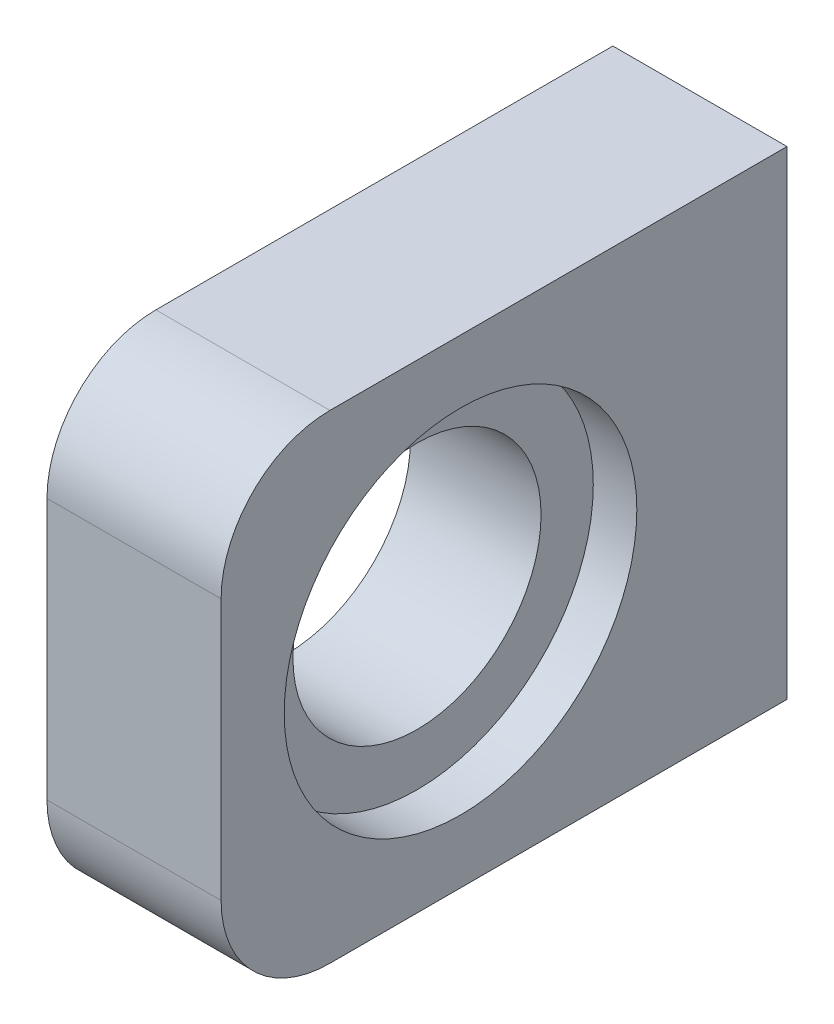
ISO-10303-21;
HEADER;
FILE_DESCRIPTION(('STEP AP214'),'2;1');
FILE_NAME('part.step','',(''),(''),'','','');
FILE_SCHEMA(('AUTOMOTIVE_DESIGN { 1 0 10303 214 1 1 1 1 }'));
ENDSEC;
DATA;
#1=APPLICATION_CONTEXT('core data for automotive mechanical design processes');
#2=APPLICATION_PROTOCOL_DEFINITION('international standard','automotive_design',2000,#1);
#3=PRODUCT_CONTEXT('',#1,'mechanical');
#4=PRODUCT('Part','Part','',(#3));
#5=PRODUCT_RELATED_PRODUCT_CATEGORY('part','',(#4));
#6=PRODUCT_DEFINITION_FORMATION('','',#4);
#7=PRODUCT_DEFINITION_CONTEXT('part definition',#1,'design');
#8=PRODUCT_DEFINITION('design','',#6,#7);
#9=PRODUCT_DEFINITION_SHAPE('','',#8);
#10=(LENGTH_UNIT() NAMED_UNIT(*) SI_UNIT(.MILLI.,.METRE.));
#11=(NAMED_UNIT(*) PLANE_ANGLE_UNIT() SI_UNIT($,.RADIAN.));
#12=(NAMED_UNIT(*) SI_UNIT($,.STERADIAN.) SOLID_ANGLE_UNIT());
#13=UNCERTAINTY_MEASURE_WITH_UNIT(LENGTH_MEASURE(1.E-05),#10,'distance_accuracy_value','');
#14=(GEOMETRIC_REPRESENTATION_CONTEXT(3) GLOBAL_UNCERTAINTY_ASSIGNED_CONTEXT((#13)) GLOBAL_UNIT_ASSIGNED_CONTEXT((#10,
#11,#12)) REPRESENTATION_CONTEXT('',''));
#15=CARTESIAN_POINT('',(0.,0.,0.));
#16=DIRECTION('',(0.,0.,1.));
#17=DIRECTION('',(1.,0.,0.));
#18=AXIS2_PLACEMENT_3D('',#15,#16,#17);
#19=CARTESIAN_POINT('',(0.,22.,-4.));
#20=DIRECTION('',(0.,1.,0.));
#21=DIRECTION('',(0.,0.,1.));
#22=AXIS2_PLACEMENT_3D('',#19,#20,#21);
#23=PLANE('',#22);
#24=DIRECTION('',(0.,0.,1.));
#25=VECTOR('',#24,1.);
#26=CARTESIAN_POINT('',(0.,22.,-4.));
#27=LINE('',#26,#25);
#28=CARTESIAN_POINT('',(0.,22.,-4.));
#29=VERTEX_POINT('',#28);
#30=CARTESIAN_POINT('',(0.,22.,17.));
#31=VERTEX_POINT('',#30);
#32=EDGE_CURVE('E119',#29,#31,#27,.T.);
#33=ORIENTED_EDGE('',*,*,#32,.T.);
#34=DIRECTION('',(1.,0.,0.));
#35=VECTOR('',#34,1.);
#36=CARTESIAN_POINT('',(0.,22.,17.));
#37=LINE('',#36,#35);
#38=CARTESIAN_POINT('',(8.,22.,17.));
#39=VERTEX_POINT('',#38);
#40=EDGE_CURVE('E142',#31,#39,#37,.T.);
#41=ORIENTED_EDGE('',*,*,#40,.T.);
#42=DIRECTION('',(0.,0.,1.));
#43=VECTOR('',#42,1.);
#44=CARTESIAN_POINT('',(8.,22.,-4.));
#45=LINE('',#44,#43);
#46=CARTESIAN_POINT('',(8.,22.,-4.));
#47=VERTEX_POINT('',#46);
#48=EDGE_CURVE('E116',#47,#39,#45,.T.);
#49=ORIENTED_EDGE('',*,*,#48,.F.);
#50=DIRECTION('',(1.,0.,0.));
#51=VECTOR('',#50,1.);
#52=CARTESIAN_POINT('',(0.,22.,-4.));
#53=LINE('',#52,#51);
#54=EDGE_CURVE('E140',#29,#47,#53,.T.);
#55=ORIENTED_EDGE('',*,*,#54,.F.);
#56=EDGE_LOOP('',(#33,#41,#49,#55));
#57=FACE_BOUND('',#56,.T.);
#58=ADVANCED_FACE('F32',(#57),#23,.T.);
#59=CARTESIAN_POINT('',(0.,0.,-4.));
#60=DIRECTION('',(0.,0.,-1.));
#61=DIRECTION('',(0.,1.,0.));
#62=AXIS2_PLACEMENT_3D('',#59,#60,#61);
#63=PLANE('',#62);
#64=CARTESIAN_POINT('',(4.,16.,-4.));
#65=DIRECTION('',(0.,0.,-1.));
#66=DIRECTION('',(0.,1.,0.));
#67=AXIS2_PLACEMENT_3D('',#64,#65,#66);
#68=CIRCLE('',#67,1.64999999999999);
#69=CARTESIAN_POINT('',(4.,17.65,-4.));
#70=VERTEX_POINT('',#69);
#71=EDGE_CURVE('E100',#70,#70,#68,.T.);
#72=ORIENTED_EDGE('',*,*,#71,.F.);
#73=EDGE_LOOP('',(#72));
#74=FACE_BOUND('',#73,.T.);
#75=CARTESIAN_POINT('',(4.,6.,-4.));
#76=DIRECTION('',(0.,0.,-1.));
#77=DIRECTION('',(0.,1.,0.));
#78=AXIS2_PLACEMENT_3D('',#75,#76,#77);
#79=CIRCLE('',#78,1.64999999999999);
#80=CARTESIAN_POINT('',(4.,7.64999999999999,-4.));
#81=VERTEX_POINT('',#80);
#82=EDGE_CURVE('E99',#81,#81,#79,.T.);
#83=ORIENTED_EDGE('',*,*,#82,.F.);
#84=EDGE_LOOP('',(#83));
#85=FACE_BOUND('',#84,.T.);
#86=DIRECTION('',(0.,1.,0.));
#87=VECTOR('',#86,1.);
#88=CARTESIAN_POINT('',(8.,0.,-4.));
#89=LINE('',#88,#87);
#90=CARTESIAN_POINT('',(8.,0.,-4.));
#91=VERTEX_POINT('',#90);
#92=EDGE_CURVE('E123',#91,#47,#89,.T.);
#93=ORIENTED_EDGE('',*,*,#92,.F.);
#94=DIRECTION('',(1.,0.,0.));
#95=VECTOR('',#94,1.);
#96=CARTESIAN_POINT('',(0.,0.,-4.));
#97=LINE('',#96,#95);
#98=CARTESIAN_POINT('',(0.,0.,-4.));
#99=VERTEX_POINT('',#98);
#100=EDGE_CURVE('E130',#99,#91,#97,.T.);
#101=ORIENTED_EDGE('',*,*,#100,.F.);
#102=DIRECTION('',(0.,1.,0.));
#103=VECTOR('',#102,1.);
#104=CARTESIAN_POINT('',(0.,0.,-4.));
#105=LINE('',#104,#103);
#106=EDGE_CURVE('E127',#99,#29,#105,.T.);
#107=ORIENTED_EDGE('',*,*,#106,.T.);
#108=ORIENTED_EDGE('',*,*,#54,.T.);
#109=EDGE_LOOP('',(#93,#101,#107,#108));
#110=FACE_BOUND('',#109,.T.);
#111=ADVANCED_FACE('F177',(#74,#85,#110),#63,.T.);
#112=CARTESIAN_POINT('',(0.,0.,22.));
#113=DIRECTION('',(0.,-1.,0.));
#114=DIRECTION('',(0.,0.,-1.));
#115=AXIS2_PLACEMENT_3D('',#112,#113,#114);
#116=PLANE('',#115);
#117=DIRECTION('',(0.,0.,-1.));
#118=VECTOR('',#117,1.);
#119=CARTESIAN_POINT('',(8.,0.,22.));
#120=LINE('',#119,#118);
#121=CARTESIAN_POINT('',(8.,0.,17.));
#122=VERTEX_POINT('',#121);
#123=EDGE_CURVE('E136',#122,#91,#120,.T.);
#124=ORIENTED_EDGE('',*,*,#123,.F.);
#125=DIRECTION('',(1.,0.,0.));
#126=VECTOR('',#125,1.);
#127=CARTESIAN_POINT('',(0.,0.,17.));
#128=LINE('',#127,#126);
#129=CARTESIAN_POINT('',(0.,0.,17.));
#130=VERTEX_POINT('',#129);
#131=EDGE_CURVE('E11',#122,#130,#128,.F.);
#132=ORIENTED_EDGE('',*,*,#131,.T.);
#133=DIRECTION('',(0.,0.,-1.));
#134=VECTOR('',#133,1.);
#135=CARTESIAN_POINT('',(0.,0.,22.));
#136=LINE('',#135,#134);
#137=EDGE_CURVE('E125',#130,#99,#136,.T.);
#138=ORIENTED_EDGE('',*,*,#137,.T.);
#139=ORIENTED_EDGE('',*,*,#100,.T.);
#140=EDGE_LOOP('',(#124,#132,#138,#139));
#141=FACE_BOUND('',#140,.T.);
#142=ADVANCED_FACE('F173',(#141),#116,.T.);
#143=CARTESIAN_POINT('',(0.,22.,22.));
#144=DIRECTION('',(0.,0.,1.));
#145=DIRECTION('',(1.,0.,0.));
#146=AXIS2_PLACEMENT_3D('',#143,#144,#145);
#147=PLANE('',#146);
#148=DIRECTION('',(0.,-1.,0.));
#149=VECTOR('',#148,1.);
#150=CARTESIAN_POINT('',(8.,22.,22.));
#151=LINE('',#150,#149);
#152=CARTESIAN_POINT('',(8.,17.,22.));
#153=VERTEX_POINT('',#152);
#154=CARTESIAN_POINT('',(8.,5.,22.));
#155=VERTEX_POINT('',#154);
#156=EDGE_CURVE('E133',#153,#155,#151,.T.);
#157=ORIENTED_EDGE('',*,*,#156,.F.);
#158=DIRECTION('',(1.,0.,0.));
#159=VECTOR('',#158,1.);
#160=CARTESIAN_POINT('',(0.,17.,22.));
#161=LINE('',#160,#159);
#162=CARTESIAN_POINT('',(0.,17.,22.));
#163=VERTEX_POINT('',#162);
#164=EDGE_CURVE('E154',#153,#163,#161,.F.);
#165=ORIENTED_EDGE('',*,*,#164,.T.);
#166=DIRECTION('',(0.,-1.,0.));
#167=VECTOR('',#166,1.);
#168=CARTESIAN_POINT('',(0.,22.,22.));
#169=LINE('',#168,#167);
#170=CARTESIAN_POINT('',(0.,5.,22.));
#171=VERTEX_POINT('',#170);
#172=EDGE_CURVE('E122',#163,#171,#169,.T.);
#173=ORIENTED_EDGE('',*,*,#172,.T.);
#174=DIRECTION('',(1.,0.,0.));
#175=VECTOR('',#174,1.);
#176=CARTESIAN_POINT('',(0.,5.,22.));
#177=LINE('',#176,#175);
#178=EDGE_CURVE('E151',#171,#155,#177,.T.);
#179=ORIENTED_EDGE('',*,*,#178,.T.);
#180=EDGE_LOOP('',(#157,#165,#173,#179));
#181=FACE_BOUND('',#180,.T.);
#182=ADVANCED_FACE('F170',(#181),#147,.T.);
#183=CARTESIAN_POINT('',(0.,0.,0.));
#184=DIRECTION('',(1.,0.,0.));
#185=DIRECTION('',(0.,0.,-1.));
#186=AXIS2_PLACEMENT_3D('',#183,#184,#185);
#187=PLANE('',#186);
#188=CARTESIAN_POINT('',(0.,11.,11.));
#189=DIRECTION('',(1.,0.,0.));
#190=DIRECTION('',(0.,0.,-1.));
#191=AXIS2_PLACEMENT_3D('',#188,#189,#190);
#192=CIRCLE('',#191,5.69999999999999);
#193=CARTESIAN_POINT('',(0.,11.,5.30000000000001));
#194=VERTEX_POINT('',#193);
#195=EDGE_CURVE('E106',#194,#194,#192,.T.);
#196=ORIENTED_EDGE('',*,*,#195,.T.);
#197=EDGE_LOOP('',(#196));
#198=FACE_BOUND('',#197,.T.);
#199=ORIENTED_EDGE('',*,*,#172,.F.);
#200=CARTESIAN_POINT('',(0.,17.,17.));
#201=DIRECTION('',(1.,0.,0.));
#202=DIRECTION('',(0.,0.,-1.));
#203=AXIS2_PLACEMENT_3D('',#200,#201,#202);
#204=CIRCLE('',#203,5.);
#205=EDGE_CURVE('E40',#163,#31,#204,.F.);
#206=ORIENTED_EDGE('',*,*,#205,.T.);
#207=ORIENTED_EDGE('',*,*,#32,.F.);
#208=ORIENTED_EDGE('',*,*,#106,.F.);
#209=ORIENTED_EDGE('',*,*,#137,.F.);
#210=CARTESIAN_POINT('',(0.,5.,17.));
#211=DIRECTION('',(1.,0.,0.));
#212=DIRECTION('',(0.,0.,-1.));
#213=AXIS2_PLACEMENT_3D('',#210,#211,#212);
#214=CIRCLE('',#213,5.);
#215=EDGE_CURVE('E52',#130,#171,#214,.F.);
#216=ORIENTED_EDGE('',*,*,#215,.T.);
#217=EDGE_LOOP('',(#199,#206,#207,#208,#209,#216));
#218=FACE_BOUND('',#217,.T.);
#219=ADVANCED_FACE('F158',(#198,#218),#187,.F.);
#220=CARTESIAN_POINT('',(8.,0.,0.));
#221=DIRECTION('',(1.,0.,0.));
#222=DIRECTION('',(0.,0.,-1.));
#223=AXIS2_PLACEMENT_3D('',#220,#221,#222);
#224=PLANE('',#223);
#225=CARTESIAN_POINT('',(8.,11.,11.));
#226=DIRECTION('',(1.,0.,0.));
#227=DIRECTION('',(0.,0.,-1.));
#228=AXIS2_PLACEMENT_3D('',#225,#226,#227);
#229=CIRCLE('',#228,8.1);
#230=CARTESIAN_POINT('',(8.,11.,2.9));
#231=VERTEX_POINT('',#230);
#232=EDGE_CURVE('E112',#231,#231,#229,.T.);
#233=ORIENTED_EDGE('',*,*,#232,.F.);
#234=EDGE_LOOP('',(#233));
#235=FACE_BOUND('',#234,.T.);
#236=ORIENTED_EDGE('',*,*,#48,.T.);
#237=CARTESIAN_POINT('',(8.,17.,17.));
#238=DIRECTION('',(1.,0.,0.));
#239=DIRECTION('',(0.,0.,-1.));
#240=AXIS2_PLACEMENT_3D('',#237,#238,#239);
#241=CIRCLE('',#240,5.);
#242=EDGE_CURVE('E149',#39,#153,#241,.T.);
#243=ORIENTED_EDGE('',*,*,#242,.T.);
#244=ORIENTED_EDGE('',*,*,#156,.T.);
#245=CARTESIAN_POINT('',(8.,5.,17.));
#246=DIRECTION('',(1.,0.,0.));
#247=DIRECTION('',(0.,0.,-1.));
#248=AXIS2_PLACEMENT_3D('',#245,#246,#247);
#249=CIRCLE('',#248,5.);
#250=EDGE_CURVE('E147',#155,#122,#249,.T.);
#251=ORIENTED_EDGE('',*,*,#250,.T.);
#252=ORIENTED_EDGE('',*,*,#123,.T.);
#253=ORIENTED_EDGE('',*,*,#92,.T.);
#254=EDGE_LOOP('',(#236,#243,#244,#251,#252,#253));
#255=FACE_BOUND('',#254,.T.);
#256=ADVANCED_FACE('F168',(#235,#255),#224,.T.);
#257=CARTESIAN_POINT('',(6.,11.,11.));
#258=DIRECTION('',(1.,0.,0.));
#259=DIRECTION('',(0.,0.,-1.));
#260=AXIS2_PLACEMENT_3D('',#257,#258,#259);
#261=CYLINDRICAL_SURFACE('',#260,8.1);
#262=CARTESIAN_POINT('',(6.,11.,11.));
#263=DIRECTION('',(1.,0.,0.));
#264=DIRECTION('',(0.,0.,-1.));
#265=AXIS2_PLACEMENT_3D('',#262,#263,#264);
#266=CIRCLE('',#265,8.1);
#267=CARTESIAN_POINT('',(6.,11.,2.9));
#268=VERTEX_POINT('',#267);
#269=EDGE_CURVE('E113',#268,#268,#266,.T.);
#270=ORIENTED_EDGE('',*,*,#269,.F.);
#271=EDGE_LOOP('',(#270));
#272=FACE_BOUND('',#271,.T.);
#273=ORIENTED_EDGE('',*,*,#232,.T.);
#274=EDGE_LOOP('',(#273));
#275=FACE_BOUND('',#274,.T.);
#276=ADVANCED_FACE('F218',(#272,#275),#261,.F.);
#277=CARTESIAN_POINT('',(6.,11.,11.));
#278=DIRECTION('',(1.,0.,0.));
#279=DIRECTION('',(0.,0.,-1.));
#280=AXIS2_PLACEMENT_3D('',#277,#278,#279);
#281=PLANE('',#280);
#282=CARTESIAN_POINT('',(6.,11.,11.));
#283=DIRECTION('',(1.,0.,0.));
#284=DIRECTION('',(0.,0.,-1.));
#285=AXIS2_PLACEMENT_3D('',#282,#283,#284);
#286=CIRCLE('',#285,5.69999999999999);
#287=CARTESIAN_POINT('',(6.,11.,5.30000000000001));
#288=VERTEX_POINT('',#287);
#289=EDGE_CURVE('E229',#288,#288,#286,.T.);
#290=ORIENTED_EDGE('',*,*,#289,.F.);
#291=EDGE_LOOP('',(#290));
#292=FACE_BOUND('',#291,.T.);
#293=ORIENTED_EDGE('',*,*,#269,.T.);
#294=EDGE_LOOP('',(#293));
#295=FACE_BOUND('',#294,.T.);
#296=ADVANCED_FACE('F214',(#292,#295),#281,.T.);
#297=CARTESIAN_POINT('',(4.,6.,2.00000000000001));
#298=DIRECTION('',(0.,0.,-1.));
#299=DIRECTION('',(0.,1.,0.));
#300=AXIS2_PLACEMENT_3D('',#297,#298,#299);
#301=CONICAL_SURFACE('',#300,1.64999999999999,1.02974425867665);
#302=CARTESIAN_POINT('',(4.,6.,2.99142002139548));
#303=VERTEX_POINT('',#302);
#304=VERTEX_LOOP('',#303);
#305=FACE_BOUND('',#304,.T.);
#306=CARTESIAN_POINT('',(4.,6.,2.00000000000001));
#307=DIRECTION('',(0.,0.,-1.));
#308=DIRECTION('',(0.,1.,0.));
#309=AXIS2_PLACEMENT_3D('',#306,#307,#308);
#310=CIRCLE('',#309,1.64999999999999);
#311=CARTESIAN_POINT('',(4.,7.64999999999999,2.00000000000001));
#312=VERTEX_POINT('',#311);
#313=EDGE_CURVE('E103',#312,#312,#310,.T.);
#314=ORIENTED_EDGE('',*,*,#313,.T.);
#315=EDGE_LOOP('',(#314));
#316=FACE_BOUND('',#315,.T.);
#317=ADVANCED_FACE('F210',(#305,#316),#301,.F.);
#318=CARTESIAN_POINT('',(4.,6.,-4.));
#319=DIRECTION('',(0.,0.,-1.));
#320=DIRECTION('',(0.,1.,0.));
#321=AXIS2_PLACEMENT_3D('',#318,#319,#320);
#322=CYLINDRICAL_SURFACE('',#321,1.64999999999999);
#323=ORIENTED_EDGE('',*,*,#313,.F.);
#324=EDGE_LOOP('',(#323));
#325=FACE_BOUND('',#324,.T.);
#326=ORIENTED_EDGE('',*,*,#82,.T.);
#327=EDGE_LOOP('',(#326));
#328=FACE_BOUND('',#327,.T.);
#329=ADVANCED_FACE('F93',(#325,#328),#322,.F.);
#330=CARTESIAN_POINT('',(4.,16.,2.00000000000001));
#331=DIRECTION('',(0.,0.,-1.));
#332=DIRECTION('',(0.,1.,0.));
#333=AXIS2_PLACEMENT_3D('',#330,#331,#332);
#334=CONICAL_SURFACE('',#333,1.64999999999999,1.02974425867665);
#335=CARTESIAN_POINT('',(4.,16.,2.99142002139548));
#336=VERTEX_POINT('',#335);
#337=VERTEX_LOOP('',#336);
#338=FACE_BOUND('',#337,.T.);
#339=CARTESIAN_POINT('',(4.,16.,2.00000000000001));
#340=DIRECTION('',(0.,0.,-1.));
#341=DIRECTION('',(0.,1.,0.));
#342=AXIS2_PLACEMENT_3D('',#339,#340,#341);
#343=CIRCLE('',#342,1.64999999999999);
#344=CARTESIAN_POINT('',(4.,17.65,2.00000000000001));
#345=VERTEX_POINT('',#344);
#346=EDGE_CURVE('E97',#345,#345,#343,.T.);
#347=ORIENTED_EDGE('',*,*,#346,.T.);
#348=EDGE_LOOP('',(#347));
#349=FACE_BOUND('',#348,.T.);
#350=ADVANCED_FACE('F89',(#338,#349),#334,.F.);
#351=CARTESIAN_POINT('',(4.,16.,-4.));
#352=DIRECTION('',(0.,0.,-1.));
#353=DIRECTION('',(0.,1.,0.));
#354=AXIS2_PLACEMENT_3D('',#351,#352,#353);
#355=CYLINDRICAL_SURFACE('',#354,1.64999999999999);
#356=ORIENTED_EDGE('',*,*,#346,.F.);
#357=EDGE_LOOP('',(#356));
#358=FACE_BOUND('',#357,.T.);
#359=ORIENTED_EDGE('',*,*,#71,.T.);
#360=EDGE_LOOP('',(#359));
#361=FACE_BOUND('',#360,.T.);
#362=ADVANCED_FACE('F92',(#358,#361),#355,.F.);
#363=CARTESIAN_POINT('',(6.,11.,11.));
#364=DIRECTION('',(1.,0.,0.));
#365=DIRECTION('',(0.,0.,-1.));
#366=AXIS2_PLACEMENT_3D('',#363,#364,#365);
#367=CYLINDRICAL_SURFACE('',#366,5.69999999999999);
#368=ORIENTED_EDGE('',*,*,#195,.F.);
#369=EDGE_LOOP('',(#368));
#370=FACE_BOUND('',#369,.T.);
#371=ORIENTED_EDGE('',*,*,#289,.T.);
#372=EDGE_LOOP('',(#371));
#373=FACE_BOUND('',#372,.T.);
#374=ADVANCED_FACE('F194',(#370,#373),#367,.F.);
#375=CARTESIAN_POINT('',(0.,17.,17.));
#376=DIRECTION('',(1.,0.,0.));
#377=DIRECTION('',(0.,0.,-1.));
#378=AXIS2_PLACEMENT_3D('',#375,#376,#377);
#379=CYLINDRICAL_SURFACE('',#378,5.);
#380=ORIENTED_EDGE('',*,*,#205,.F.);
#381=ORIENTED_EDGE('',*,*,#164,.F.);
#382=ORIENTED_EDGE('',*,*,#242,.F.);
#383=ORIENTED_EDGE('',*,*,#40,.F.);
#384=EDGE_LOOP('',(#380,#381,#382,#383));
#385=FACE_BOUND('',#384,.T.);
#386=ADVANCED_FACE('F165',(#385),#379,.T.);
#387=CARTESIAN_POINT('',(0.,5.,17.));
#388=DIRECTION('',(1.,0.,0.));
#389=DIRECTION('',(0.,0.,-1.));
#390=AXIS2_PLACEMENT_3D('',#387,#388,#389);
#391=CYLINDRICAL_SURFACE('',#390,5.);
#392=ORIENTED_EDGE('',*,*,#215,.F.);
#393=ORIENTED_EDGE('',*,*,#131,.F.);
#394=ORIENTED_EDGE('',*,*,#250,.F.);
#395=ORIENTED_EDGE('',*,*,#178,.F.);
#396=EDGE_LOOP('',(#392,#393,#394,#395));
#397=FACE_BOUND('',#396,.T.);
#398=ADVANCED_FACE('F34',(#397),#391,.T.);
#399=CLOSED_SHELL('',(#58,#111,#142,#182,#219,#256,#276,#296,#317,#329,#350,#362,#374,#386,#398));
#400=MANIFOLD_SOLID_BREP('B2',#399);
#401=ADVANCED_BREP_SHAPE_REPRESENTATION('',(#18,#400),#14);
#402=SHAPE_DEFINITION_REPRESENTATION(#9,#401);
ENDSEC;
END-ISO-10303-21;
